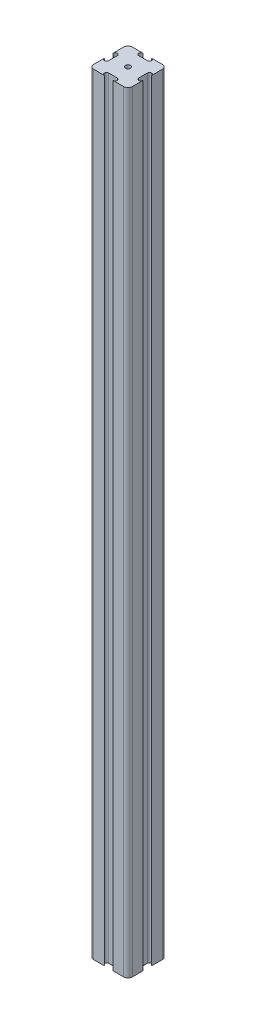
ISO-10303-21;
HEADER;
FILE_DESCRIPTION(('STEP AP214'),'2;1');
FILE_NAME('part.step','',(''),(''),'','','');
FILE_SCHEMA(('AUTOMOTIVE_DESIGN { 1 0 10303 214 1 1 1 1 }'));
ENDSEC;
DATA;
#1=APPLICATION_CONTEXT('core data for automotive mechanical design processes');
#2=APPLICATION_PROTOCOL_DEFINITION('international standard','automotive_design',2000,#1);
#3=PRODUCT_CONTEXT('',#1,'mechanical');
#4=PRODUCT('Part','Part','',(#3));
#5=PRODUCT_RELATED_PRODUCT_CATEGORY('part','',(#4));
#6=PRODUCT_DEFINITION_FORMATION('','',#4);
#7=PRODUCT_DEFINITION_CONTEXT('part definition',#1,'design');
#8=PRODUCT_DEFINITION('design','',#6,#7);
#9=PRODUCT_DEFINITION_SHAPE('','',#8);
#10=(LENGTH_UNIT() NAMED_UNIT(*) SI_UNIT(.MILLI.,.METRE.));
#11=(NAMED_UNIT(*) PLANE_ANGLE_UNIT() SI_UNIT($,.RADIAN.));
#12=(NAMED_UNIT(*) SI_UNIT($,.STERADIAN.) SOLID_ANGLE_UNIT());
#13=UNCERTAINTY_MEASURE_WITH_UNIT(LENGTH_MEASURE(1.E-05),#10,'distance_accuracy_value','');
#14=(GEOMETRIC_REPRESENTATION_CONTEXT(3) GLOBAL_UNCERTAINTY_ASSIGNED_CONTEXT((#13)) GLOBAL_UNIT_ASSIGNED_CONTEXT((#10,
#11,#12)) REPRESENTATION_CONTEXT('',''));
#15=CARTESIAN_POINT('',(0.,0.,0.));
#16=DIRECTION('',(0.,0.,1.));
#17=DIRECTION('',(1.,0.,0.));
#18=AXIS2_PLACEMENT_3D('',#15,#16,#17);
#19=CARTESIAN_POINT('',(-20.,900.,5.));
#20=DIRECTION('',(0.,-1.,0.));
#21=DIRECTION('',(0.,0.,-1.));
#22=AXIS2_PLACEMENT_3D('',#19,#20,#21);
#23=CYLINDRICAL_SURFACE('',#22,2.5);
#24=CARTESIAN_POINT('',(-20.,0.,5.));
#25=DIRECTION('',(0.,-1.,0.));
#26=DIRECTION('',(0.,0.,-1.));
#27=AXIS2_PLACEMENT_3D('',#24,#25,#26);
#28=CIRCLE('',#27,2.5);
#29=CARTESIAN_POINT('',(-17.5,0.,5.));
#30=VERTEX_POINT('',#29);
#31=CARTESIAN_POINT('',(-22.5,0.,5.));
#32=VERTEX_POINT('',#31);
#33=EDGE_CURVE('E225',#30,#32,#28,.T.);
#34=ORIENTED_EDGE('',*,*,#33,.T.);
#35=DIRECTION('',(0.,-1.,0.));
#36=VECTOR('',#35,1.);
#37=CARTESIAN_POINT('',(-22.5,900.,5.));
#38=LINE('',#37,#36);
#39=CARTESIAN_POINT('',(-22.5,900.,5.));
#40=VERTEX_POINT('',#39);
#41=EDGE_CURVE('E11',#40,#32,#38,.T.);
#42=ORIENTED_EDGE('',*,*,#41,.F.);
#43=CARTESIAN_POINT('',(-20.,900.,5.));
#44=DIRECTION('',(0.,-1.,0.));
#45=DIRECTION('',(0.,0.,-1.));
#46=AXIS2_PLACEMENT_3D('',#43,#44,#45);
#47=CIRCLE('',#46,2.5);
#48=CARTESIAN_POINT('',(-17.5,900.,5.));
#49=VERTEX_POINT('',#48);
#50=EDGE_CURVE('E290',#49,#40,#47,.T.);
#51=ORIENTED_EDGE('',*,*,#50,.F.);
#52=DIRECTION('',(0.,-1.,0.));
#53=VECTOR('',#52,1.);
#54=CARTESIAN_POINT('',(-17.5,900.,5.));
#55=LINE('',#54,#53);
#56=EDGE_CURVE('E221',#49,#30,#55,.T.);
#57=ORIENTED_EDGE('',*,*,#56,.T.);
#58=EDGE_LOOP('',(#34,#42,#51,#57));
#59=FACE_BOUND('',#58,.T.);
#60=ADVANCED_FACE('F33',(#59),#23,.F.);
#61=CARTESIAN_POINT('',(-22.5,900.,5.));
#62=DIRECTION('',(1.,0.,0.));
#63=DIRECTION('',(0.,0.,-1.));
#64=AXIS2_PLACEMENT_3D('',#61,#62,#63);
#65=PLANE('',#64);
#66=DIRECTION('',(0.,0.,1.));
#67=VECTOR('',#66,1.);
#68=CARTESIAN_POINT('',(-22.5,0.,5.));
#69=LINE('',#68,#67);
#70=CARTESIAN_POINT('',(-22.5,0.,17.4999999999999));
#71=VERTEX_POINT('',#70);
#72=EDGE_CURVE('E228',#32,#71,#69,.T.);
#73=ORIENTED_EDGE('',*,*,#72,.T.);
#74=DIRECTION('',(0.,-1.,0.));
#75=VECTOR('',#74,1.);
#76=CARTESIAN_POINT('',(-22.5,900.,17.4999999999999));
#77=LINE('',#76,#75);
#78=CARTESIAN_POINT('',(-22.5,900.,17.4999999999999));
#79=VERTEX_POINT('',#78);
#80=EDGE_CURVE('E41',#79,#71,#77,.T.);
#81=ORIENTED_EDGE('',*,*,#80,.F.);
#82=DIRECTION('',(0.,0.,1.));
#83=VECTOR('',#82,1.);
#84=CARTESIAN_POINT('',(-22.5,900.,5.));
#85=LINE('',#84,#83);
#86=EDGE_CURVE('E136',#40,#79,#85,.T.);
#87=ORIENTED_EDGE('',*,*,#86,.F.);
#88=ORIENTED_EDGE('',*,*,#41,.T.);
#89=EDGE_LOOP('',(#73,#81,#87,#88));
#90=FACE_BOUND('',#89,.T.);
#91=ADVANCED_FACE('F417',(#90),#65,.F.);
#92=CARTESIAN_POINT('',(-17.5,900.,17.5));
#93=DIRECTION('',(0.,-1.,0.));
#94=DIRECTION('',(0.,0.,-1.));
#95=AXIS2_PLACEMENT_3D('',#92,#93,#94);
#96=CYLINDRICAL_SURFACE('',#95,5.);
#97=CARTESIAN_POINT('',(-17.5,0.,17.5));
#98=DIRECTION('',(0.,1.,0.));
#99=DIRECTION('',(0.,0.,1.));
#100=AXIS2_PLACEMENT_3D('',#97,#98,#99);
#101=CIRCLE('',#100,5.);
#102=CARTESIAN_POINT('',(-17.5,0.,22.5));
#103=VERTEX_POINT('',#102);
#104=EDGE_CURVE('E231',#71,#103,#101,.T.);
#105=ORIENTED_EDGE('',*,*,#104,.T.);
#106=DIRECTION('',(0.,-1.,0.));
#107=VECTOR('',#106,1.);
#108=CARTESIAN_POINT('',(-17.5,900.,22.5));
#109=LINE('',#108,#107);
#110=CARTESIAN_POINT('',(-17.5,900.,22.5));
#111=VERTEX_POINT('',#110);
#112=EDGE_CURVE('E329',#111,#103,#109,.T.);
#113=ORIENTED_EDGE('',*,*,#112,.F.);
#114=CARTESIAN_POINT('',(-17.5,900.,17.5));
#115=DIRECTION('',(0.,1.,0.));
#116=DIRECTION('',(0.,0.,1.));
#117=AXIS2_PLACEMENT_3D('',#114,#115,#116);
#118=CIRCLE('',#117,5.);
#119=EDGE_CURVE('E336',#79,#111,#118,.T.);
#120=ORIENTED_EDGE('',*,*,#119,.F.);
#121=ORIENTED_EDGE('',*,*,#80,.T.);
#122=EDGE_LOOP('',(#105,#113,#120,#121));
#123=FACE_BOUND('',#122,.T.);
#124=ADVANCED_FACE('F334',(#123),#96,.T.);
#125=CARTESIAN_POINT('',(-4.99999999999998,900.,22.5));
#126=DIRECTION('',(0.,0.,1.));
#127=DIRECTION('',(1.,0.,0.));
#128=AXIS2_PLACEMENT_3D('',#125,#126,#127);
#129=PLANE('',#128);
#130=DIRECTION('',(-1.,0.,0.));
#131=VECTOR('',#130,1.);
#132=CARTESIAN_POINT('',(-4.99999999999998,0.,22.5));
#133=LINE('',#132,#131);
#134=CARTESIAN_POINT('',(-4.99999999999998,0.,22.5));
#135=VERTEX_POINT('',#134);
#136=EDGE_CURVE('E234',#135,#103,#133,.T.);
#137=ORIENTED_EDGE('',*,*,#136,.F.);
#138=DIRECTION('',(0.,-1.,0.));
#139=VECTOR('',#138,1.);
#140=CARTESIAN_POINT('',(-4.99999999999998,900.,22.5));
#141=LINE('',#140,#139);
#142=CARTESIAN_POINT('',(-4.99999999999998,900.,22.5));
#143=VERTEX_POINT('',#142);
#144=EDGE_CURVE('E327',#143,#135,#141,.T.);
#145=ORIENTED_EDGE('',*,*,#144,.F.);
#146=DIRECTION('',(-1.,0.,0.));
#147=VECTOR('',#146,1.);
#148=CARTESIAN_POINT('',(-4.99999999999998,900.,22.5));
#149=LINE('',#148,#147);
#150=EDGE_CURVE('E347',#143,#111,#149,.T.);
#151=ORIENTED_EDGE('',*,*,#150,.T.);
#152=ORIENTED_EDGE('',*,*,#112,.T.);
#153=EDGE_LOOP('',(#137,#145,#151,#152));
#154=FACE_BOUND('',#153,.T.);
#155=ADVANCED_FACE('F344',(#154),#129,.T.);
#156=CARTESIAN_POINT('',(-5.,900.,20.));
#157=DIRECTION('',(0.,-1.,0.));
#158=DIRECTION('',(0.,0.,-1.));
#159=AXIS2_PLACEMENT_3D('',#156,#157,#158);
#160=CYLINDRICAL_SURFACE('',#159,2.5);
#161=CARTESIAN_POINT('',(-5.,0.,20.));
#162=DIRECTION('',(0.,1.,0.));
#163=DIRECTION('',(0.,0.,1.));
#164=AXIS2_PLACEMENT_3D('',#161,#162,#163);
#165=CIRCLE('',#164,2.5);
#166=CARTESIAN_POINT('',(-4.99999999999998,0.,17.5));
#167=VERTEX_POINT('',#166);
#168=EDGE_CURVE('E237',#167,#135,#165,.T.);
#169=ORIENTED_EDGE('',*,*,#168,.F.);
#170=DIRECTION('',(0.,-1.,0.));
#171=VECTOR('',#170,1.);
#172=CARTESIAN_POINT('',(-4.99999999999998,900.,17.5));
#173=LINE('',#172,#171);
#174=CARTESIAN_POINT('',(-4.99999999999998,900.,17.5));
#175=VERTEX_POINT('',#174);
#176=EDGE_CURVE('E325',#175,#167,#173,.T.);
#177=ORIENTED_EDGE('',*,*,#176,.F.);
#178=CARTESIAN_POINT('',(-5.,900.,20.));
#179=DIRECTION('',(0.,1.,0.));
#180=DIRECTION('',(0.,0.,1.));
#181=AXIS2_PLACEMENT_3D('',#178,#179,#180);
#182=CIRCLE('',#181,2.5);
#183=EDGE_CURVE('E350',#175,#143,#182,.T.);
#184=ORIENTED_EDGE('',*,*,#183,.T.);
#185=ORIENTED_EDGE('',*,*,#144,.T.);
#186=EDGE_LOOP('',(#169,#177,#184,#185));
#187=FACE_BOUND('',#186,.T.);
#188=ADVANCED_FACE('F624',(#187),#160,.F.);
#189=CARTESIAN_POINT('',(-4.99999999999998,900.,17.5));
#190=DIRECTION('',(0.,0.,-1.));
#191=DIRECTION('',(-1.,0.,0.));
#192=AXIS2_PLACEMENT_3D('',#189,#190,#191);
#193=PLANE('',#192);
#194=DIRECTION('',(1.,0.,0.));
#195=VECTOR('',#194,1.);
#196=CARTESIAN_POINT('',(-4.99999999999998,0.,17.5));
#197=LINE('',#196,#195);
#198=CARTESIAN_POINT('',(5.00000000000002,0.,17.5));
#199=VERTEX_POINT('',#198);
#200=EDGE_CURVE('E240',#167,#199,#197,.T.);
#201=ORIENTED_EDGE('',*,*,#200,.T.);
#202=DIRECTION('',(0.,-1.,0.));
#203=VECTOR('',#202,1.);
#204=CARTESIAN_POINT('',(5.00000000000002,900.,17.5));
#205=LINE('',#204,#203);
#206=CARTESIAN_POINT('',(5.00000000000002,900.,17.5));
#207=VERTEX_POINT('',#206);
#208=EDGE_CURVE('E323',#207,#199,#205,.T.);
#209=ORIENTED_EDGE('',*,*,#208,.F.);
#210=DIRECTION('',(1.,0.,0.));
#211=VECTOR('',#210,1.);
#212=CARTESIAN_POINT('',(-4.99999999999998,900.,17.5));
#213=LINE('',#212,#211);
#214=EDGE_CURVE('E352',#175,#207,#213,.T.);
#215=ORIENTED_EDGE('',*,*,#214,.F.);
#216=ORIENTED_EDGE('',*,*,#176,.T.);
#217=EDGE_LOOP('',(#201,#209,#215,#216));
#218=FACE_BOUND('',#217,.T.);
#219=ADVANCED_FACE('F614',(#218),#193,.F.);
#220=CARTESIAN_POINT('',(4.99999999999996,900.,20.));
#221=DIRECTION('',(0.,-1.,0.));
#222=DIRECTION('',(0.,0.,-1.));
#223=AXIS2_PLACEMENT_3D('',#220,#221,#222);
#224=CYLINDRICAL_SURFACE('',#223,2.50000000000001);
#225=CARTESIAN_POINT('',(4.99999999999996,0.,20.));
#226=DIRECTION('',(0.,1.,0.));
#227=DIRECTION('',(0.,0.,1.));
#228=AXIS2_PLACEMENT_3D('',#225,#226,#227);
#229=CIRCLE('',#228,2.50000000000001);
#230=CARTESIAN_POINT('',(4.99999999999996,0.,22.5));
#231=VERTEX_POINT('',#230);
#232=EDGE_CURVE('E243',#231,#199,#229,.T.);
#233=ORIENTED_EDGE('',*,*,#232,.F.);
#234=DIRECTION('',(0.,-1.,0.));
#235=VECTOR('',#234,1.);
#236=CARTESIAN_POINT('',(4.99999999999996,900.,22.5));
#237=LINE('',#236,#235);
#238=CARTESIAN_POINT('',(4.99999999999996,900.,22.5));
#239=VERTEX_POINT('',#238);
#240=EDGE_CURVE('E321',#239,#231,#237,.T.);
#241=ORIENTED_EDGE('',*,*,#240,.F.);
#242=CARTESIAN_POINT('',(4.99999999999996,900.,20.));
#243=DIRECTION('',(0.,1.,0.));
#244=DIRECTION('',(0.,0.,1.));
#245=AXIS2_PLACEMENT_3D('',#242,#243,#244);
#246=CIRCLE('',#245,2.50000000000001);
#247=EDGE_CURVE('E358',#239,#207,#246,.T.);
#248=ORIENTED_EDGE('',*,*,#247,.T.);
#249=ORIENTED_EDGE('',*,*,#208,.T.);
#250=EDGE_LOOP('',(#233,#241,#248,#249));
#251=FACE_BOUND('',#250,.T.);
#252=ADVANCED_FACE('F604',(#251),#224,.F.);
#253=CARTESIAN_POINT('',(4.99999999999996,900.,22.5));
#254=DIRECTION('',(0.,0.,-1.));
#255=DIRECTION('',(-1.,0.,0.));
#256=AXIS2_PLACEMENT_3D('',#253,#254,#255);
#257=PLANE('',#256);
#258=DIRECTION('',(1.,0.,0.));
#259=VECTOR('',#258,1.);
#260=CARTESIAN_POINT('',(4.99999999999996,0.,22.5));
#261=LINE('',#260,#259);
#262=CARTESIAN_POINT('',(17.5,0.,22.5));
#263=VERTEX_POINT('',#262);
#264=EDGE_CURVE('E246',#231,#263,#261,.T.);
#265=ORIENTED_EDGE('',*,*,#264,.T.);
#266=DIRECTION('',(0.,-1.,0.));
#267=VECTOR('',#266,1.);
#268=CARTESIAN_POINT('',(17.5,900.,22.5));
#269=LINE('',#268,#267);
#270=CARTESIAN_POINT('',(17.5,900.,22.5));
#271=VERTEX_POINT('',#270);
#272=EDGE_CURVE('E318',#271,#263,#269,.T.);
#273=ORIENTED_EDGE('',*,*,#272,.F.);
#274=DIRECTION('',(1.,0.,0.));
#275=VECTOR('',#274,1.);
#276=CARTESIAN_POINT('',(4.99999999999996,900.,22.5));
#277=LINE('',#276,#275);
#278=EDGE_CURVE('E361',#239,#271,#277,.T.);
#279=ORIENTED_EDGE('',*,*,#278,.F.);
#280=ORIENTED_EDGE('',*,*,#240,.T.);
#281=EDGE_LOOP('',(#265,#273,#279,#280));
#282=FACE_BOUND('',#281,.T.);
#283=ADVANCED_FACE('F594',(#282),#257,.F.);
#284=CARTESIAN_POINT('',(17.5000000000006,900.,17.5));
#285=DIRECTION('',(0.,-1.,0.));
#286=DIRECTION('',(0.,0.,-1.));
#287=AXIS2_PLACEMENT_3D('',#284,#285,#286);
#288=CYLINDRICAL_SURFACE('',#287,5.);
#289=CARTESIAN_POINT('',(17.5000000000006,0.,17.5));
#290=DIRECTION('',(0.,1.,0.));
#291=DIRECTION('',(0.,0.,1.));
#292=AXIS2_PLACEMENT_3D('',#289,#290,#291);
#293=CIRCLE('',#292,5.);
#294=CARTESIAN_POINT('',(22.5,0.,17.5000025246919));
#295=VERTEX_POINT('',#294);
#296=EDGE_CURVE('E248',#263,#295,#293,.T.);
#297=ORIENTED_EDGE('',*,*,#296,.T.);
#298=DIRECTION('',(0.,-1.,0.));
#299=VECTOR('',#298,1.);
#300=CARTESIAN_POINT('',(22.5,900.,17.5000025246919));
#301=LINE('',#300,#299);
#302=CARTESIAN_POINT('',(22.5,900.,17.5000025246919));
#303=VERTEX_POINT('',#302);
#304=EDGE_CURVE('E316',#303,#295,#301,.T.);
#305=ORIENTED_EDGE('',*,*,#304,.F.);
#306=CARTESIAN_POINT('',(17.5000000000006,900.,17.5));
#307=DIRECTION('',(0.,1.,0.));
#308=DIRECTION('',(0.,0.,1.));
#309=AXIS2_PLACEMENT_3D('',#306,#307,#308);
#310=CIRCLE('',#309,5.);
#311=EDGE_CURVE('E363',#271,#303,#310,.T.);
#312=ORIENTED_EDGE('',*,*,#311,.F.);
#313=ORIENTED_EDGE('',*,*,#272,.T.);
#314=EDGE_LOOP('',(#297,#305,#312,#313));
#315=FACE_BOUND('',#314,.T.);
#316=ADVANCED_FACE('F584',(#315),#288,.T.);
#317=CARTESIAN_POINT('',(22.5,900.,5.00000252469196));
#318=DIRECTION('',(1.,0.,0.));
#319=DIRECTION('',(0.,0.,-1.));
#320=AXIS2_PLACEMENT_3D('',#317,#318,#319);
#321=PLANE('',#320);
#322=DIRECTION('',(0.,0.,1.));
#323=VECTOR('',#322,1.);
#324=CARTESIAN_POINT('',(22.5,0.,5.00000252469196));
#325=LINE('',#324,#323);
#326=CARTESIAN_POINT('',(22.5,0.,5.00000252469196));
#327=VERTEX_POINT('',#326);
#328=EDGE_CURVE('E251',#327,#295,#325,.T.);
#329=ORIENTED_EDGE('',*,*,#328,.F.);
#330=DIRECTION('',(0.,-1.,0.));
#331=VECTOR('',#330,1.);
#332=CARTESIAN_POINT('',(22.5,900.,5.00000252469196));
#333=LINE('',#332,#331);
#334=CARTESIAN_POINT('',(22.5,900.,5.00000252469196));
#335=VERTEX_POINT('',#334);
#336=EDGE_CURVE('E314',#335,#327,#333,.T.);
#337=ORIENTED_EDGE('',*,*,#336,.F.);
#338=DIRECTION('',(0.,0.,1.));
#339=VECTOR('',#338,1.);
#340=CARTESIAN_POINT('',(22.5,900.,5.00000252469196));
#341=LINE('',#340,#339);
#342=EDGE_CURVE('E365',#335,#303,#341,.T.);
#343=ORIENTED_EDGE('',*,*,#342,.T.);
#344=ORIENTED_EDGE('',*,*,#304,.T.);
#345=EDGE_LOOP('',(#329,#337,#343,#344));
#346=FACE_BOUND('',#345,.T.);
#347=ADVANCED_FACE('F574',(#346),#321,.T.);
#348=CARTESIAN_POINT('',(20.,900.,5.00000252469196));
#349=DIRECTION('',(0.,-1.,0.));
#350=DIRECTION('',(0.,0.,-1.));
#351=AXIS2_PLACEMENT_3D('',#348,#349,#350);
#352=CYLINDRICAL_SURFACE('',#351,2.5);
#353=CARTESIAN_POINT('',(20.,0.,5.00000252469196));
#354=DIRECTION('',(0.,-1.,0.));
#355=DIRECTION('',(0.,0.,-1.));
#356=AXIS2_PLACEMENT_3D('',#353,#354,#355);
#357=CIRCLE('',#356,2.5);
#358=CARTESIAN_POINT('',(17.5,0.,5.00000252469196));
#359=VERTEX_POINT('',#358);
#360=EDGE_CURVE('E254',#327,#359,#357,.T.);
#361=ORIENTED_EDGE('',*,*,#360,.T.);
#362=DIRECTION('',(0.,-1.,0.));
#363=VECTOR('',#362,1.);
#364=CARTESIAN_POINT('',(17.5,900.,5.00000252469196));
#365=LINE('',#364,#363);
#366=CARTESIAN_POINT('',(17.5,900.,5.00000252469196));
#367=VERTEX_POINT('',#366);
#368=EDGE_CURVE('E312',#367,#359,#365,.T.);
#369=ORIENTED_EDGE('',*,*,#368,.F.);
#370=CARTESIAN_POINT('',(20.,900.,5.00000252469196));
#371=DIRECTION('',(0.,-1.,0.));
#372=DIRECTION('',(0.,0.,-1.));
#373=AXIS2_PLACEMENT_3D('',#370,#371,#372);
#374=CIRCLE('',#373,2.5);
#375=EDGE_CURVE('E368',#335,#367,#374,.T.);
#376=ORIENTED_EDGE('',*,*,#375,.F.);
#377=ORIENTED_EDGE('',*,*,#336,.T.);
#378=EDGE_LOOP('',(#361,#369,#376,#377));
#379=FACE_BOUND('',#378,.T.);
#380=ADVANCED_FACE('F564',(#379),#352,.F.);
#381=CARTESIAN_POINT('',(17.5,900.,-4.99999747530804));
#382=DIRECTION('',(1.,0.,0.));
#383=DIRECTION('',(0.,0.,-1.));
#384=AXIS2_PLACEMENT_3D('',#381,#382,#383);
#385=PLANE('',#384);
#386=DIRECTION('',(0.,0.,1.));
#387=VECTOR('',#386,1.);
#388=CARTESIAN_POINT('',(17.5,0.,-4.99999747530804));
#389=LINE('',#388,#387);
#390=CARTESIAN_POINT('',(17.5,0.,-4.99999747530804));
#391=VERTEX_POINT('',#390);
#392=EDGE_CURVE('E257',#391,#359,#389,.T.);
#393=ORIENTED_EDGE('',*,*,#392,.F.);
#394=DIRECTION('',(0.,-1.,0.));
#395=VECTOR('',#394,1.);
#396=CARTESIAN_POINT('',(17.5,900.,-4.99999747530804));
#397=LINE('',#396,#395);
#398=CARTESIAN_POINT('',(17.5,900.,-4.99999747530804));
#399=VERTEX_POINT('',#398);
#400=EDGE_CURVE('E310',#399,#391,#397,.T.);
#401=ORIENTED_EDGE('',*,*,#400,.F.);
#402=DIRECTION('',(0.,0.,1.));
#403=VECTOR('',#402,1.);
#404=CARTESIAN_POINT('',(17.5,900.,-4.99999747530804));
#405=LINE('',#404,#403);
#406=EDGE_CURVE('E370',#399,#367,#405,.T.);
#407=ORIENTED_EDGE('',*,*,#406,.T.);
#408=ORIENTED_EDGE('',*,*,#368,.T.);
#409=EDGE_LOOP('',(#393,#401,#407,#408));
#410=FACE_BOUND('',#409,.T.);
#411=ADVANCED_FACE('F554',(#410),#385,.T.);
#412=CARTESIAN_POINT('',(20.,900.,-4.99999747530804));
#413=DIRECTION('',(0.,-1.,0.));
#414=DIRECTION('',(0.,0.,-1.));
#415=AXIS2_PLACEMENT_3D('',#412,#413,#414);
#416=CYLINDRICAL_SURFACE('',#415,2.5);
#417=CARTESIAN_POINT('',(20.,0.,-4.99999747530804));
#418=DIRECTION('',(0.,1.,0.));
#419=DIRECTION('',(0.,0.,1.));
#420=AXIS2_PLACEMENT_3D('',#417,#418,#419);
#421=CIRCLE('',#420,2.5);
#422=CARTESIAN_POINT('',(22.5,0.,-4.99999747530804));
#423=VERTEX_POINT('',#422);
#424=EDGE_CURVE('E260',#423,#391,#421,.T.);
#425=ORIENTED_EDGE('',*,*,#424,.F.);
#426=DIRECTION('',(0.,-1.,0.));
#427=VECTOR('',#426,1.);
#428=CARTESIAN_POINT('',(22.5,900.,-4.99999747530804));
#429=LINE('',#428,#427);
#430=CARTESIAN_POINT('',(22.5,900.,-4.99999747530804));
#431=VERTEX_POINT('',#430);
#432=EDGE_CURVE('E308',#431,#423,#429,.T.);
#433=ORIENTED_EDGE('',*,*,#432,.F.);
#434=CARTESIAN_POINT('',(20.,900.,-4.99999747530804));
#435=DIRECTION('',(0.,1.,0.));
#436=DIRECTION('',(0.,0.,1.));
#437=AXIS2_PLACEMENT_3D('',#434,#435,#436);
#438=CIRCLE('',#437,2.5);
#439=EDGE_CURVE('E373',#431,#399,#438,.T.);
#440=ORIENTED_EDGE('',*,*,#439,.T.);
#441=ORIENTED_EDGE('',*,*,#400,.T.);
#442=EDGE_LOOP('',(#425,#433,#440,#441));
#443=FACE_BOUND('',#442,.T.);
#444=ADVANCED_FACE('F544',(#443),#416,.F.);
#445=CARTESIAN_POINT('',(22.5,900.,-4.99999747530804));
#446=DIRECTION('',(-1.,0.,0.));
#447=DIRECTION('',(0.,0.,1.));
#448=AXIS2_PLACEMENT_3D('',#445,#446,#447);
#449=PLANE('',#448);
#450=DIRECTION('',(0.,0.,-1.));
#451=VECTOR('',#450,1.);
#452=CARTESIAN_POINT('',(22.5,0.,-4.99999747530804));
#453=LINE('',#452,#451);
#454=CARTESIAN_POINT('',(22.5,0.,-17.499997475308));
#455=VERTEX_POINT('',#454);
#456=EDGE_CURVE('E263',#423,#455,#453,.T.);
#457=ORIENTED_EDGE('',*,*,#456,.T.);
#458=DIRECTION('',(0.,-1.,0.));
#459=VECTOR('',#458,1.);
#460=CARTESIAN_POINT('',(22.5,900.,-17.499997475308));
#461=LINE('',#460,#459);
#462=CARTESIAN_POINT('',(22.5,900.,-17.499997475308));
#463=VERTEX_POINT('',#462);
#464=EDGE_CURVE('E306',#463,#455,#461,.T.);
#465=ORIENTED_EDGE('',*,*,#464,.F.);
#466=DIRECTION('',(0.,0.,-1.));
#467=VECTOR('',#466,1.);
#468=CARTESIAN_POINT('',(22.5,900.,-4.99999747530804));
#469=LINE('',#468,#467);
#470=EDGE_CURVE('E376',#431,#463,#469,.T.);
#471=ORIENTED_EDGE('',*,*,#470,.F.);
#472=ORIENTED_EDGE('',*,*,#432,.T.);
#473=EDGE_LOOP('',(#457,#465,#471,#472));
#474=FACE_BOUND('',#473,.T.);
#475=ADVANCED_FACE('F534',(#474),#449,.F.);
#476=CARTESIAN_POINT('',(17.5000000000006,900.,-17.5));
#477=DIRECTION('',(0.,-1.,0.));
#478=DIRECTION('',(0.,0.,-1.));
#479=AXIS2_PLACEMENT_3D('',#476,#477,#478);
#480=CYLINDRICAL_SURFACE('',#479,5.00000000000001);
#481=CARTESIAN_POINT('',(17.5000000000006,0.,-17.5));
#482=DIRECTION('',(0.,-1.,0.));
#483=DIRECTION('',(0.,0.,-1.));
#484=AXIS2_PLACEMENT_3D('',#481,#482,#483);
#485=CIRCLE('',#484,5.00000000000001);
#486=CARTESIAN_POINT('',(17.5,0.,-22.5));
#487=VERTEX_POINT('',#486);
#488=EDGE_CURVE('E266',#487,#455,#485,.T.);
#489=ORIENTED_EDGE('',*,*,#488,.F.);
#490=DIRECTION('',(0.,-1.,0.));
#491=VECTOR('',#490,1.);
#492=CARTESIAN_POINT('',(17.5,900.,-22.5));
#493=LINE('',#492,#491);
#494=CARTESIAN_POINT('',(17.5,900.,-22.5));
#495=VERTEX_POINT('',#494);
#496=EDGE_CURVE('E304',#495,#487,#493,.T.);
#497=ORIENTED_EDGE('',*,*,#496,.F.);
#498=CARTESIAN_POINT('',(17.5000000000006,900.,-17.5));
#499=DIRECTION('',(0.,-1.,0.));
#500=DIRECTION('',(0.,0.,-1.));
#501=AXIS2_PLACEMENT_3D('',#498,#499,#500);
#502=CIRCLE('',#501,5.00000000000001);
#503=EDGE_CURVE('E378',#495,#463,#502,.T.);
#504=ORIENTED_EDGE('',*,*,#503,.T.);
#505=ORIENTED_EDGE('',*,*,#464,.T.);
#506=EDGE_LOOP('',(#489,#497,#504,#505));
#507=FACE_BOUND('',#506,.T.);
#508=ADVANCED_FACE('F524',(#507),#480,.T.);
#509=CARTESIAN_POINT('',(5.00000000000003,900.,-22.5));
#510=DIRECTION('',(0.,0.,-1.));
#511=DIRECTION('',(-1.,0.,0.));
#512=AXIS2_PLACEMENT_3D('',#509,#510,#511);
#513=PLANE('',#512);
#514=DIRECTION('',(1.,0.,0.));
#515=VECTOR('',#514,1.);
#516=CARTESIAN_POINT('',(5.00000000000003,0.,-22.5));
#517=LINE('',#516,#515);
#518=CARTESIAN_POINT('',(5.00000000000003,0.,-22.5));
#519=VERTEX_POINT('',#518);
#520=EDGE_CURVE('E269',#519,#487,#517,.T.);
#521=ORIENTED_EDGE('',*,*,#520,.F.);
#522=DIRECTION('',(0.,-1.,0.));
#523=VECTOR('',#522,1.);
#524=CARTESIAN_POINT('',(5.00000000000003,900.,-22.5));
#525=LINE('',#524,#523);
#526=CARTESIAN_POINT('',(5.00000000000003,900.,-22.5));
#527=VERTEX_POINT('',#526);
#528=EDGE_CURVE('E302',#527,#519,#525,.T.);
#529=ORIENTED_EDGE('',*,*,#528,.F.);
#530=DIRECTION('',(1.,0.,0.));
#531=VECTOR('',#530,1.);
#532=CARTESIAN_POINT('',(5.00000000000003,900.,-22.5));
#533=LINE('',#532,#531);
#534=EDGE_CURVE('E381',#527,#495,#533,.T.);
#535=ORIENTED_EDGE('',*,*,#534,.T.);
#536=ORIENTED_EDGE('',*,*,#496,.T.);
#537=EDGE_LOOP('',(#521,#529,#535,#536));
#538=FACE_BOUND('',#537,.T.);
#539=ADVANCED_FACE('F514',(#538),#513,.T.);
#540=CARTESIAN_POINT('',(5.00000000000003,900.,-20.));
#541=DIRECTION('',(0.,-1.,0.));
#542=DIRECTION('',(0.,0.,-1.));
#543=AXIS2_PLACEMENT_3D('',#540,#541,#542);
#544=CYLINDRICAL_SURFACE('',#543,2.50000000000001);
#545=CARTESIAN_POINT('',(5.00000000000003,0.,-20.));
#546=DIRECTION('',(0.,1.,0.));
#547=DIRECTION('',(0.,0.,1.));
#548=AXIS2_PLACEMENT_3D('',#545,#546,#547);
#549=CIRCLE('',#548,2.50000000000001);
#550=CARTESIAN_POINT('',(5.00000000000001,0.,-17.5));
#551=VERTEX_POINT('',#550);
#552=EDGE_CURVE('E272',#551,#519,#549,.T.);
#553=ORIENTED_EDGE('',*,*,#552,.F.);
#554=DIRECTION('',(0.,-1.,0.));
#555=VECTOR('',#554,1.);
#556=CARTESIAN_POINT('',(5.00000000000001,900.,-17.5));
#557=LINE('',#556,#555);
#558=CARTESIAN_POINT('',(5.00000000000001,900.,-17.5));
#559=VERTEX_POINT('',#558);
#560=EDGE_CURVE('E300',#559,#551,#557,.T.);
#561=ORIENTED_EDGE('',*,*,#560,.F.);
#562=CARTESIAN_POINT('',(5.00000000000003,900.,-20.));
#563=DIRECTION('',(0.,1.,0.));
#564=DIRECTION('',(0.,0.,1.));
#565=AXIS2_PLACEMENT_3D('',#562,#563,#564);
#566=CIRCLE('',#565,2.50000000000001);
#567=EDGE_CURVE('E384',#559,#527,#566,.T.);
#568=ORIENTED_EDGE('',*,*,#567,.T.);
#569=ORIENTED_EDGE('',*,*,#528,.T.);
#570=EDGE_LOOP('',(#553,#561,#568,#569));
#571=FACE_BOUND('',#570,.T.);
#572=ADVANCED_FACE('F504',(#571),#544,.F.);
#573=CARTESIAN_POINT('',(-5.,900.,-17.5));
#574=DIRECTION('',(0.,0.,-1.));
#575=DIRECTION('',(-1.,0.,0.));
#576=AXIS2_PLACEMENT_3D('',#573,#574,#575);
#577=PLANE('',#576);
#578=DIRECTION('',(1.,0.,0.));
#579=VECTOR('',#578,1.);
#580=CARTESIAN_POINT('',(-5.,0.,-17.5));
#581=LINE('',#580,#579);
#582=CARTESIAN_POINT('',(-5.,0.,-17.5));
#583=VERTEX_POINT('',#582);
#584=EDGE_CURVE('E275',#583,#551,#581,.T.);
#585=ORIENTED_EDGE('',*,*,#584,.F.);
#586=DIRECTION('',(0.,-1.,0.));
#587=VECTOR('',#586,1.);
#588=CARTESIAN_POINT('',(-5.,900.,-17.5));
#589=LINE('',#588,#587);
#590=CARTESIAN_POINT('',(-5.,900.,-17.5));
#591=VERTEX_POINT('',#590);
#592=EDGE_CURVE('E298',#591,#583,#589,.T.);
#593=ORIENTED_EDGE('',*,*,#592,.F.);
#594=DIRECTION('',(1.,0.,0.));
#595=VECTOR('',#594,1.);
#596=CARTESIAN_POINT('',(-5.,900.,-17.5));
#597=LINE('',#596,#595);
#598=EDGE_CURVE('E387',#591,#559,#597,.T.);
#599=ORIENTED_EDGE('',*,*,#598,.T.);
#600=ORIENTED_EDGE('',*,*,#560,.T.);
#601=EDGE_LOOP('',(#585,#593,#599,#600));
#602=FACE_BOUND('',#601,.T.);
#603=ADVANCED_FACE('F495',(#602),#577,.T.);
#604=CARTESIAN_POINT('',(-5.00000000000003,900.,-20.));
#605=DIRECTION('',(0.,-1.,0.));
#606=DIRECTION('',(0.,0.,-1.));
#607=AXIS2_PLACEMENT_3D('',#604,#605,#606);
#608=CYLINDRICAL_SURFACE('',#607,2.5);
#609=CARTESIAN_POINT('',(-5.00000000000003,0.,-20.));
#610=DIRECTION('',(0.,1.,0.));
#611=DIRECTION('',(0.,0.,1.));
#612=AXIS2_PLACEMENT_3D('',#609,#610,#611);
#613=CIRCLE('',#612,2.5);
#614=CARTESIAN_POINT('',(-5.00000000000003,0.,-22.5));
#615=VERTEX_POINT('',#614);
#616=EDGE_CURVE('E278',#615,#583,#613,.T.);
#617=ORIENTED_EDGE('',*,*,#616,.F.);
#618=DIRECTION('',(0.,-1.,0.));
#619=VECTOR('',#618,1.);
#620=CARTESIAN_POINT('',(-5.00000000000003,900.,-22.5));
#621=LINE('',#620,#619);
#622=CARTESIAN_POINT('',(-5.00000000000003,900.,-22.5));
#623=VERTEX_POINT('',#622);
#624=EDGE_CURVE('E296',#623,#615,#621,.T.);
#625=ORIENTED_EDGE('',*,*,#624,.F.);
#626=CARTESIAN_POINT('',(-5.00000000000003,900.,-20.));
#627=DIRECTION('',(0.,1.,0.));
#628=DIRECTION('',(0.,0.,1.));
#629=AXIS2_PLACEMENT_3D('',#626,#627,#628);
#630=CIRCLE('',#629,2.5);
#631=EDGE_CURVE('E390',#623,#591,#630,.T.);
#632=ORIENTED_EDGE('',*,*,#631,.T.);
#633=ORIENTED_EDGE('',*,*,#592,.T.);
#634=EDGE_LOOP('',(#617,#625,#632,#633));
#635=FACE_BOUND('',#634,.T.);
#636=ADVANCED_FACE('F403',(#635),#608,.F.);
#637=CARTESIAN_POINT('',(-17.5,900.,-22.5));
#638=DIRECTION('',(0.,0.,-1.));
#639=DIRECTION('',(-1.,0.,0.));
#640=AXIS2_PLACEMENT_3D('',#637,#638,#639);
#641=PLANE('',#640);
#642=DIRECTION('',(1.,0.,0.));
#643=VECTOR('',#642,1.);
#644=CARTESIAN_POINT('',(-17.5,0.,-22.5));
#645=LINE('',#644,#643);
#646=CARTESIAN_POINT('',(-17.5,0.,-22.5));
#647=VERTEX_POINT('',#646);
#648=EDGE_CURVE('E281',#647,#615,#645,.T.);
#649=ORIENTED_EDGE('',*,*,#648,.F.);
#650=DIRECTION('',(0.,-1.,0.));
#651=VECTOR('',#650,1.);
#652=CARTESIAN_POINT('',(-17.5,900.,-22.5));
#653=LINE('',#652,#651);
#654=CARTESIAN_POINT('',(-17.5,900.,-22.5));
#655=VERTEX_POINT('',#654);
#656=EDGE_CURVE('E294',#655,#647,#653,.T.);
#657=ORIENTED_EDGE('',*,*,#656,.F.);
#658=DIRECTION('',(1.,0.,0.));
#659=VECTOR('',#658,1.);
#660=CARTESIAN_POINT('',(-17.5,900.,-22.5));
#661=LINE('',#660,#659);
#662=EDGE_CURVE('E393',#655,#623,#661,.T.);
#663=ORIENTED_EDGE('',*,*,#662,.T.);
#664=ORIENTED_EDGE('',*,*,#624,.T.);
#665=EDGE_LOOP('',(#649,#657,#663,#664));
#666=FACE_BOUND('',#665,.T.);
#667=ADVANCED_FACE('F397',(#666),#641,.T.);
#668=CARTESIAN_POINT('',(-17.5,900.,-17.5));
#669=DIRECTION('',(0.,-1.,0.));
#670=DIRECTION('',(0.,0.,-1.));
#671=AXIS2_PLACEMENT_3D('',#668,#669,#670);
#672=CYLINDRICAL_SURFACE('',#671,5.00000000000001);
#673=CARTESIAN_POINT('',(-17.5,0.,-17.5));
#674=DIRECTION('',(0.,1.,0.));
#675=DIRECTION('',(0.,0.,1.));
#676=AXIS2_PLACEMENT_3D('',#673,#674,#675);
#677=CIRCLE('',#676,5.00000000000001);
#678=CARTESIAN_POINT('',(-22.5,0.,-17.5));
#679=VERTEX_POINT('',#678);
#680=EDGE_CURVE('E284',#647,#679,#677,.T.);
#681=ORIENTED_EDGE('',*,*,#680,.T.);
#682=DIRECTION('',(0.,-1.,0.));
#683=VECTOR('',#682,1.);
#684=CARTESIAN_POINT('',(-22.5,900.,-17.5));
#685=LINE('',#684,#683);
#686=CARTESIAN_POINT('',(-22.5,900.,-17.5));
#687=VERTEX_POINT('',#686);
#688=EDGE_CURVE('E217',#687,#679,#685,.T.);
#689=ORIENTED_EDGE('',*,*,#688,.F.);
#690=CARTESIAN_POINT('',(-17.5,900.,-17.5));
#691=DIRECTION('',(0.,1.,0.));
#692=DIRECTION('',(0.,0.,1.));
#693=AXIS2_PLACEMENT_3D('',#690,#691,#692);
#694=CIRCLE('',#693,5.00000000000001);
#695=EDGE_CURVE('E204',#655,#687,#694,.T.);
#696=ORIENTED_EDGE('',*,*,#695,.F.);
#697=ORIENTED_EDGE('',*,*,#656,.T.);
#698=EDGE_LOOP('',(#681,#689,#696,#697));
#699=FACE_BOUND('',#698,.T.);
#700=ADVANCED_FACE('F407',(#699),#672,.T.);
#701=CARTESIAN_POINT('',(-22.5,900.,-17.5));
#702=DIRECTION('',(1.,0.,0.));
#703=DIRECTION('',(0.,0.,-1.));
#704=AXIS2_PLACEMENT_3D('',#701,#702,#703);
#705=PLANE('',#704);
#706=DIRECTION('',(0.,0.,1.));
#707=VECTOR('',#706,1.);
#708=CARTESIAN_POINT('',(-22.5,0.,-17.5));
#709=LINE('',#708,#707);
#710=CARTESIAN_POINT('',(-22.5,0.,-5.));
#711=VERTEX_POINT('',#710);
#712=EDGE_CURVE('E213',#679,#711,#709,.T.);
#713=ORIENTED_EDGE('',*,*,#712,.T.);
#714=DIRECTION('',(0.,-1.,0.));
#715=VECTOR('',#714,1.);
#716=CARTESIAN_POINT('',(-22.5,900.,-5.));
#717=LINE('',#716,#715);
#718=CARTESIAN_POINT('',(-22.5,900.,-5.));
#719=VERTEX_POINT('',#718);
#720=EDGE_CURVE('E210',#719,#711,#717,.T.);
#721=ORIENTED_EDGE('',*,*,#720,.F.);
#722=DIRECTION('',(0.,0.,1.));
#723=VECTOR('',#722,1.);
#724=CARTESIAN_POINT('',(-22.5,900.,-17.5));
#725=LINE('',#724,#723);
#726=EDGE_CURVE('E197',#687,#719,#725,.T.);
#727=ORIENTED_EDGE('',*,*,#726,.F.);
#728=ORIENTED_EDGE('',*,*,#688,.T.);
#729=EDGE_LOOP('',(#713,#721,#727,#728));
#730=FACE_BOUND('',#729,.T.);
#731=ADVANCED_FACE('F211',(#730),#705,.F.);
#732=CARTESIAN_POINT('',(-20.,900.,-5.));
#733=DIRECTION('',(0.,-1.,0.));
#734=DIRECTION('',(0.,0.,-1.));
#735=AXIS2_PLACEMENT_3D('',#732,#733,#734);
#736=CYLINDRICAL_SURFACE('',#735,2.5);
#737=CARTESIAN_POINT('',(-20.,0.,-5.));
#738=DIRECTION('',(0.,1.,0.));
#739=DIRECTION('',(0.,0.,1.));
#740=AXIS2_PLACEMENT_3D('',#737,#738,#739);
#741=CIRCLE('',#740,2.5);
#742=CARTESIAN_POINT('',(-17.5,0.,-5.));
#743=VERTEX_POINT('',#742);
#744=EDGE_CURVE('E287',#743,#711,#741,.T.);
#745=ORIENTED_EDGE('',*,*,#744,.F.);
#746=DIRECTION('',(0.,-1.,0.));
#747=VECTOR('',#746,1.);
#748=CARTESIAN_POINT('',(-17.5,900.,-5.));
#749=LINE('',#748,#747);
#750=CARTESIAN_POINT('',(-17.5,900.,-5.));
#751=VERTEX_POINT('',#750);
#752=EDGE_CURVE('E125',#751,#743,#749,.T.);
#753=ORIENTED_EDGE('',*,*,#752,.F.);
#754=CARTESIAN_POINT('',(-20.,900.,-5.));
#755=DIRECTION('',(0.,1.,0.));
#756=DIRECTION('',(0.,0.,1.));
#757=AXIS2_PLACEMENT_3D('',#754,#755,#756);
#758=CIRCLE('',#757,2.5);
#759=EDGE_CURVE('E201',#751,#719,#758,.T.);
#760=ORIENTED_EDGE('',*,*,#759,.T.);
#761=ORIENTED_EDGE('',*,*,#720,.T.);
#762=EDGE_LOOP('',(#745,#753,#760,#761));
#763=FACE_BOUND('',#762,.T.);
#764=ADVANCED_FACE('F219',(#763),#736,.F.);
#765=CARTESIAN_POINT('',(-17.5,900.,-5.));
#766=DIRECTION('',(1.,0.,0.));
#767=DIRECTION('',(0.,0.,-1.));
#768=AXIS2_PLACEMENT_3D('',#765,#766,#767);
#769=PLANE('',#768);
#770=DIRECTION('',(0.,0.,1.));
#771=VECTOR('',#770,1.);
#772=CARTESIAN_POINT('',(-17.5,0.,-5.));
#773=LINE('',#772,#771);
#774=EDGE_CURVE('E128',#743,#30,#773,.T.);
#775=ORIENTED_EDGE('',*,*,#774,.T.);
#776=ORIENTED_EDGE('',*,*,#56,.F.);
#777=DIRECTION('',(0.,0.,1.));
#778=VECTOR('',#777,1.);
#779=CARTESIAN_POINT('',(-17.5,900.,-5.));
#780=LINE('',#779,#778);
#781=EDGE_CURVE('E49',#751,#49,#780,.T.);
#782=ORIENTED_EDGE('',*,*,#781,.F.);
#783=ORIENTED_EDGE('',*,*,#752,.T.);
#784=EDGE_LOOP('',(#775,#776,#782,#783));
#785=FACE_BOUND('',#784,.T.);
#786=ADVANCED_FACE('F424',(#785),#769,.F.);
#787=CARTESIAN_POINT('',(-20.,900.,5.));
#788=DIRECTION('',(0.,-1.,0.));
#789=DIRECTION('',(0.,0.,-1.));
#790=AXIS2_PLACEMENT_3D('',#787,#788,#789);
#791=PLANE('',#790);
#792=CARTESIAN_POINT('',(0.,900.,0.));
#793=DIRECTION('',(0.,-1.,0.));
#794=DIRECTION('',(0.,0.,-1.));
#795=AXIS2_PLACEMENT_3D('',#792,#793,#794);
#796=CIRCLE('',#795,3.);
#797=CARTESIAN_POINT('',(0.,900.,-3.));
#798=VERTEX_POINT('',#797);
#799=EDGE_CURVE('E229',#798,#798,#796,.T.);
#800=ORIENTED_EDGE('',*,*,#799,.T.);
#801=EDGE_LOOP('',(#800));
#802=FACE_BOUND('',#801,.T.);
#803=ORIENTED_EDGE('',*,*,#50,.T.);
#804=ORIENTED_EDGE('',*,*,#86,.T.);
#805=ORIENTED_EDGE('',*,*,#119,.T.);
#806=ORIENTED_EDGE('',*,*,#150,.F.);
#807=ORIENTED_EDGE('',*,*,#183,.F.);
#808=ORIENTED_EDGE('',*,*,#214,.T.);
#809=ORIENTED_EDGE('',*,*,#247,.F.);
#810=ORIENTED_EDGE('',*,*,#278,.T.);
#811=ORIENTED_EDGE('',*,*,#311,.T.);
#812=ORIENTED_EDGE('',*,*,#342,.F.);
#813=ORIENTED_EDGE('',*,*,#375,.T.);
#814=ORIENTED_EDGE('',*,*,#406,.F.);
#815=ORIENTED_EDGE('',*,*,#439,.F.);
#816=ORIENTED_EDGE('',*,*,#470,.T.);
#817=ORIENTED_EDGE('',*,*,#503,.F.);
#818=ORIENTED_EDGE('',*,*,#534,.F.);
#819=ORIENTED_EDGE('',*,*,#567,.F.);
#820=ORIENTED_EDGE('',*,*,#598,.F.);
#821=ORIENTED_EDGE('',*,*,#631,.F.);
#822=ORIENTED_EDGE('',*,*,#662,.F.);
#823=ORIENTED_EDGE('',*,*,#695,.T.);
#824=ORIENTED_EDGE('',*,*,#726,.T.);
#825=ORIENTED_EDGE('',*,*,#759,.F.);
#826=ORIENTED_EDGE('',*,*,#781,.T.);
#827=EDGE_LOOP('',(#803,#804,#805,#806,#807,#808,#809,#810,#811,#812,#813,#814,#815,#816,#817,
#818,#819,#820,#821,#822,#823,#824,#825,#826));
#828=FACE_BOUND('',#827,.T.);
#829=ADVANCED_FACE('F199',(#802,#828),#791,.F.);
#830=CARTESIAN_POINT('',(-20.,0.,5.));
#831=DIRECTION('',(0.,-1.,0.));
#832=DIRECTION('',(0.,0.,-1.));
#833=AXIS2_PLACEMENT_3D('',#830,#831,#832);
#834=PLANE('',#833);
#835=CARTESIAN_POINT('',(0.,0.,0.));
#836=DIRECTION('',(0.,-1.,0.));
#837=DIRECTION('',(0.,0.,-1.));
#838=AXIS2_PLACEMENT_3D('',#835,#836,#837);
#839=CIRCLE('',#838,3.);
#840=CARTESIAN_POINT('',(0.,0.,-3.));
#841=VERTEX_POINT('',#840);
#842=EDGE_CURVE('E448',#841,#841,#839,.T.);
#843=ORIENTED_EDGE('',*,*,#842,.F.);
#844=EDGE_LOOP('',(#843));
#845=FACE_BOUND('',#844,.T.);
#846=ORIENTED_EDGE('',*,*,#33,.F.);
#847=ORIENTED_EDGE('',*,*,#774,.F.);
#848=ORIENTED_EDGE('',*,*,#744,.T.);
#849=ORIENTED_EDGE('',*,*,#712,.F.);
#850=ORIENTED_EDGE('',*,*,#680,.F.);
#851=ORIENTED_EDGE('',*,*,#648,.T.);
#852=ORIENTED_EDGE('',*,*,#616,.T.);
#853=ORIENTED_EDGE('',*,*,#584,.T.);
#854=ORIENTED_EDGE('',*,*,#552,.T.);
#855=ORIENTED_EDGE('',*,*,#520,.T.);
#856=ORIENTED_EDGE('',*,*,#488,.T.);
#857=ORIENTED_EDGE('',*,*,#456,.F.);
#858=ORIENTED_EDGE('',*,*,#424,.T.);
#859=ORIENTED_EDGE('',*,*,#392,.T.);
#860=ORIENTED_EDGE('',*,*,#360,.F.);
#861=ORIENTED_EDGE('',*,*,#328,.T.);
#862=ORIENTED_EDGE('',*,*,#296,.F.);
#863=ORIENTED_EDGE('',*,*,#264,.F.);
#864=ORIENTED_EDGE('',*,*,#232,.T.);
#865=ORIENTED_EDGE('',*,*,#200,.F.);
#866=ORIENTED_EDGE('',*,*,#168,.T.);
#867=ORIENTED_EDGE('',*,*,#136,.T.);
#868=ORIENTED_EDGE('',*,*,#104,.F.);
#869=ORIENTED_EDGE('',*,*,#72,.F.);
#870=EDGE_LOOP('',(#846,#847,#848,#849,#850,#851,#852,#853,#854,#855,#856,#857,#858,#859,#860,
#861,#862,#863,#864,#865,#866,#867,#868,#869));
#871=FACE_BOUND('',#870,.T.);
#872=ADVANCED_FACE('F339',(#845,#871),#834,.T.);
#873=CARTESIAN_POINT('',(0.,900.,0.));
#874=DIRECTION('',(0.,-1.,0.));
#875=DIRECTION('',(0.,0.,-1.));
#876=AXIS2_PLACEMENT_3D('',#873,#874,#875);
#877=CYLINDRICAL_SURFACE('',#876,3.);
#878=ORIENTED_EDGE('',*,*,#799,.F.);
#879=EDGE_LOOP('',(#878));
#880=FACE_BOUND('',#879,.T.);
#881=ORIENTED_EDGE('',*,*,#842,.T.);
#882=EDGE_LOOP('',(#881));
#883=FACE_BOUND('',#882,.T.);
#884=ADVANCED_FACE('F436',(#880,#883),#877,.F.);
#885=CLOSED_SHELL('',(#60,#91,#124,#155,#188,#219,#252,#283,#316,#347,#380,#411,#444,#475,#508,
#539,#572,#603,#636,#667,#700,#731,#764,#786,#829,#872,#884));
#886=MANIFOLD_SOLID_BREP('B2',#885);
#887=ADVANCED_BREP_SHAPE_REPRESENTATION('',(#18,#886),#14);
#888=SHAPE_DEFINITION_REPRESENTATION(#9,#887);
ENDSEC;
END-ISO-10303-21;
